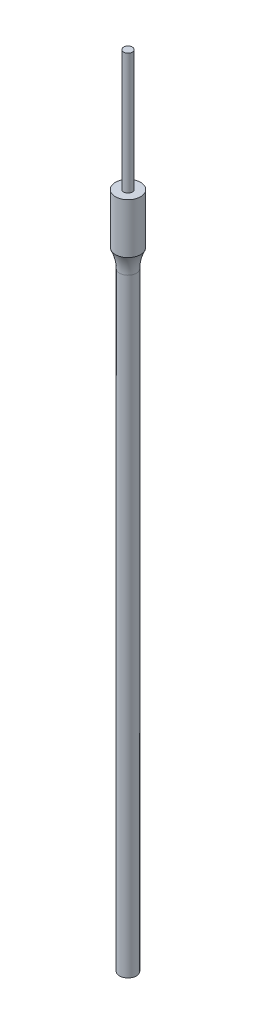
ISO-10303-21;
HEADER;
FILE_DESCRIPTION(('STEP AP214'),'2;1');
FILE_NAME('part.step','',(''),(''),'','','');
FILE_SCHEMA(('AUTOMOTIVE_DESIGN { 1 0 10303 214 1 1 1 1 }'));
ENDSEC;
DATA;
#1=APPLICATION_CONTEXT('core data for automotive mechanical design processes');
#2=APPLICATION_PROTOCOL_DEFINITION('international standard','automotive_design',2000,#1);
#3=PRODUCT_CONTEXT('',#1,'mechanical');
#4=PRODUCT('Part','Part','',(#3));
#5=PRODUCT_RELATED_PRODUCT_CATEGORY('part','',(#4));
#6=PRODUCT_DEFINITION_FORMATION('','',#4);
#7=PRODUCT_DEFINITION_CONTEXT('part definition',#1,'design');
#8=PRODUCT_DEFINITION('design','',#6,#7);
#9=PRODUCT_DEFINITION_SHAPE('','',#8);
#10=(LENGTH_UNIT() NAMED_UNIT(*) SI_UNIT(.MILLI.,.METRE.));
#11=(NAMED_UNIT(*) PLANE_ANGLE_UNIT() SI_UNIT($,.RADIAN.));
#12=(NAMED_UNIT(*) SI_UNIT($,.STERADIAN.) SOLID_ANGLE_UNIT());
#13=UNCERTAINTY_MEASURE_WITH_UNIT(LENGTH_MEASURE(1.E-05),#10,'distance_accuracy_value','');
#14=(GEOMETRIC_REPRESENTATION_CONTEXT(3) GLOBAL_UNCERTAINTY_ASSIGNED_CONTEXT((#13)) GLOBAL_UNIT_ASSIGNED_CONTEXT((#10,
#11,#12)) REPRESENTATION_CONTEXT('',''));
#15=CARTESIAN_POINT('',(0.,0.,0.));
#16=DIRECTION('',(0.,0.,1.));
#17=DIRECTION('',(1.,0.,0.));
#18=AXIS2_PLACEMENT_3D('',#15,#16,#17);
#19=CARTESIAN_POINT('',(0.,191.,0.));
#20=DIRECTION('',(0.,-1.,0.));
#21=DIRECTION('',(0.,0.,-1.));
#22=AXIS2_PLACEMENT_3D('',#19,#20,#21);
#23=CYLINDRICAL_SURFACE('',#22,1.04830224817629);
#24=CARTESIAN_POINT('',(0.,191.,0.));
#25=DIRECTION('',(0.,1.,0.));
#26=DIRECTION('',(0.,0.,1.));
#27=AXIS2_PLACEMENT_3D('',#24,#25,#26);
#28=CIRCLE('',#27,1.04830224817629);
#29=CARTESIAN_POINT('',(0.,191.,1.04830224817629));
#30=VERTEX_POINT('',#29);
#31=EDGE_CURVE('E11',#30,#30,#28,.T.);
#32=ORIENTED_EDGE('',*,*,#31,.F.);
#33=EDGE_LOOP('',(#32));
#34=FACE_BOUND('',#33,.T.);
#35=CARTESIAN_POINT('',(0.,162.,0.));
#36=DIRECTION('',(0.,1.,0.));
#37=DIRECTION('',(0.,0.,1.));
#38=AXIS2_PLACEMENT_3D('',#35,#36,#37);
#39=CIRCLE('',#38,1.04830224817629);
#40=CARTESIAN_POINT('',(0.,162.,1.04830224817629));
#41=VERTEX_POINT('',#40);
#42=EDGE_CURVE('E54',#41,#41,#39,.T.);
#43=ORIENTED_EDGE('',*,*,#42,.T.);
#44=EDGE_LOOP('',(#43));
#45=FACE_BOUND('',#44,.T.);
#46=ADVANCED_FACE('F51',(#34,#45),#23,.T.);
#47=CARTESIAN_POINT('',(0.,191.,0.));
#48=DIRECTION('',(0.,1.,0.));
#49=DIRECTION('',(0.,0.,1.));
#50=AXIS2_PLACEMENT_3D('',#47,#48,#49);
#51=PLANE('',#50);
#52=ORIENTED_EDGE('',*,*,#31,.T.);
#53=EDGE_LOOP('',(#52));
#54=FACE_BOUND('',#53,.T.);
#55=ADVANCED_FACE('F66',(#54),#51,.T.);
#56=CARTESIAN_POINT('',(0.,162.,0.));
#57=DIRECTION('',(0.,1.,0.));
#58=DIRECTION('',(0.,0.,1.));
#59=AXIS2_PLACEMENT_3D('',#56,#57,#58);
#60=PLANE('',#59);
#61=ORIENTED_EDGE('',*,*,#42,.F.);
#62=EDGE_LOOP('',(#61));
#63=FACE_BOUND('',#62,.T.);
#64=ADVANCED_FACE('F64',(#63),#60,.F.);
#65=CLOSED_SHELL('',(#46,#55,#64));
#66=MANIFOLD_SOLID_BREP('B2',#65);
#67=CARTESIAN_POINT('',(0.,150.,0.));
#68=DIRECTION('',(0.,-1.,0.));
#69=DIRECTION('',(0.,0.,-1.));
#70=AXIS2_PLACEMENT_3D('',#67,#68,#69);
#71=CYLINDRICAL_SURFACE('',#70,2.);
#72=CARTESIAN_POINT('',(0.,145.641101056459,0.));
#73=DIRECTION('',(0.,1.,0.));
#74=DIRECTION('',(0.,0.,1.));
#75=AXIS2_PLACEMENT_3D('',#72,#73,#74);
#76=CIRCLE('',#75,2.);
#77=CARTESIAN_POINT('',(0.,145.641101056459,2.));
#78=VERTEX_POINT('',#77);
#79=EDGE_CURVE('E50',#78,#78,#76,.F.);
#80=ORIENTED_EDGE('',*,*,#79,.T.);
#81=EDGE_LOOP('',(#80));
#82=FACE_BOUND('',#81,.T.);
#83=CARTESIAN_POINT('',(0.,0.,0.));
#84=DIRECTION('',(0.,1.,0.));
#85=DIRECTION('',(0.,0.,1.));
#86=AXIS2_PLACEMENT_3D('',#83,#84,#85);
#87=CIRCLE('',#86,2.);
#88=CARTESIAN_POINT('',(0.,0.,2.));
#89=VERTEX_POINT('',#88);
#90=EDGE_CURVE('E106',#89,#89,#87,.T.);
#91=ORIENTED_EDGE('',*,*,#90,.T.);
#92=EDGE_LOOP('',(#91));
#93=FACE_BOUND('',#92,.T.);
#94=ADVANCED_FACE('F98',(#82,#93),#71,.T.);
#95=CARTESIAN_POINT('',(0.,0.,0.));
#96=DIRECTION('',(0.,1.,0.));
#97=DIRECTION('',(0.,0.,1.));
#98=AXIS2_PLACEMENT_3D('',#95,#96,#97);
#99=PLANE('',#98);
#100=ORIENTED_EDGE('',*,*,#90,.F.);
#101=EDGE_LOOP('',(#100));
#102=FACE_BOUND('',#101,.T.);
#103=ADVANCED_FACE('F134',(#102),#99,.F.);
#104=CARTESIAN_POINT('',(0.,162.,0.));
#105=DIRECTION('',(0.,-1.,0.));
#106=DIRECTION('',(0.,0.,-1.));
#107=AXIS2_PLACEMENT_3D('',#104,#105,#106);
#108=CYLINDRICAL_SURFACE('',#107,3.);
#109=CARTESIAN_POINT('',(0.,162.,0.));
#110=DIRECTION('',(0.,1.,0.));
#111=DIRECTION('',(0.,0.,1.));
#112=AXIS2_PLACEMENT_3D('',#109,#110,#111);
#113=CIRCLE('',#112,3.);
#114=CARTESIAN_POINT('',(0.,162.,3.));
#115=VERTEX_POINT('',#114);
#116=EDGE_CURVE('E111',#115,#115,#113,.T.);
#117=ORIENTED_EDGE('',*,*,#116,.F.);
#118=EDGE_LOOP('',(#117));
#119=FACE_BOUND('',#118,.T.);
#120=CARTESIAN_POINT('',(0.,150.,0.));
#121=DIRECTION('',(0.,1.,0.));
#122=DIRECTION('',(0.,0.,1.));
#123=AXIS2_PLACEMENT_3D('',#120,#121,#122);
#124=CIRCLE('',#123,3.);
#125=CARTESIAN_POINT('',(0.,150.,3.));
#126=VERTEX_POINT('',#125);
#127=EDGE_CURVE('E116',#126,#126,#124,.T.);
#128=ORIENTED_EDGE('',*,*,#127,.T.);
#129=EDGE_LOOP('',(#128));
#130=FACE_BOUND('',#129,.T.);
#131=ADVANCED_FACE('F123',(#119,#130),#108,.T.);
#132=CARTESIAN_POINT('',(0.,162.,0.));
#133=DIRECTION('',(0.,1.,0.));
#134=DIRECTION('',(0.,0.,1.));
#135=AXIS2_PLACEMENT_3D('',#132,#133,#134);
#136=PLANE('',#135);
#137=ORIENTED_EDGE('',*,*,#116,.T.);
#138=EDGE_LOOP('',(#137));
#139=FACE_BOUND('',#138,.T.);
#140=ADVANCED_FACE('F126',(#139),#136,.T.);
#141=CARTESIAN_POINT('',(0.,145.641101056459,0.));
#142=DIRECTION('',(0.,1.,0.));
#143=DIRECTION('',(0.,0.,1.));
#144=AXIS2_PLACEMENT_3D('',#141,#142,#143);
#145=TOROIDAL_SURFACE('',#144,12.,10.);
#146=ORIENTED_EDGE('',*,*,#79,.F.);
#147=EDGE_LOOP('',(#146));
#148=FACE_BOUND('',#147,.T.);
#149=ORIENTED_EDGE('',*,*,#127,.F.);
#150=EDGE_LOOP('',(#149));
#151=FACE_BOUND('',#150,.T.);
#152=ADVANCED_FACE('F100',(#148,#151),#145,.F.);
#153=CLOSED_SHELL('',(#94,#103,#131,#140,#152));
#154=MANIFOLD_SOLID_BREP('B6',#153);
#155=ADVANCED_BREP_SHAPE_REPRESENTATION('',(#18,#66,#154),#14);
#156=SHAPE_DEFINITION_REPRESENTATION(#9,#155);
ENDSEC;
END-ISO-10303-21;
